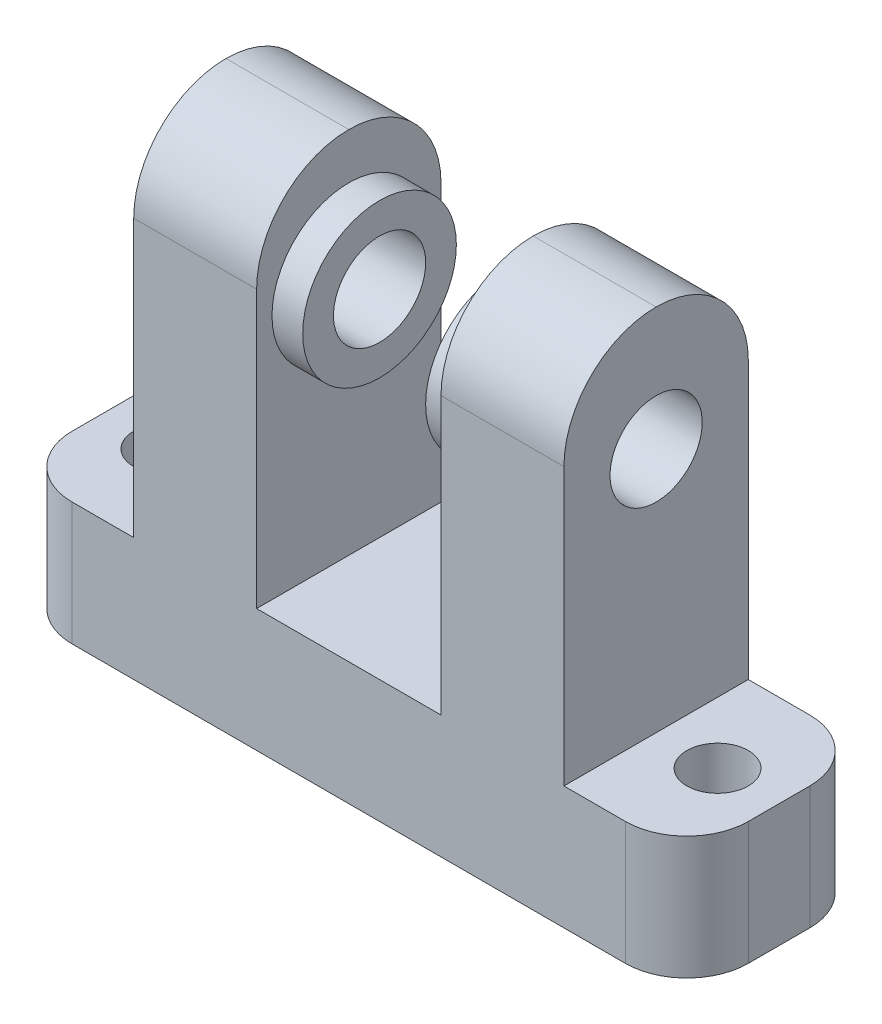
ISO-10303-21;
HEADER;
FILE_DESCRIPTION(('STEP AP214'),'2;1');
FILE_NAME('part.step','',(''),(''),'','','');
FILE_SCHEMA(('AUTOMOTIVE_DESIGN { 1 0 10303 214 1 1 1 1 }'));
ENDSEC;
DATA;
#1=APPLICATION_CONTEXT('core data for automotive mechanical design processes');
#2=APPLICATION_PROTOCOL_DEFINITION('international standard','automotive_design',2000,#1);
#3=PRODUCT_CONTEXT('',#1,'mechanical');
#4=PRODUCT('Part','Part','',(#3));
#5=PRODUCT_RELATED_PRODUCT_CATEGORY('part','',(#4));
#6=PRODUCT_DEFINITION_FORMATION('','',#4);
#7=PRODUCT_DEFINITION_CONTEXT('part definition',#1,'design');
#8=PRODUCT_DEFINITION('design','',#6,#7);
#9=PRODUCT_DEFINITION_SHAPE('','',#8);
#10=(LENGTH_UNIT() NAMED_UNIT(*) SI_UNIT(.MILLI.,.METRE.));
#11=(NAMED_UNIT(*) PLANE_ANGLE_UNIT() SI_UNIT($,.RADIAN.));
#12=(NAMED_UNIT(*) SI_UNIT($,.STERADIAN.) SOLID_ANGLE_UNIT());
#13=UNCERTAINTY_MEASURE_WITH_UNIT(LENGTH_MEASURE(1.E-05),#10,'distance_accuracy_value','');
#14=(GEOMETRIC_REPRESENTATION_CONTEXT(3) GLOBAL_UNCERTAINTY_ASSIGNED_CONTEXT((#13)) GLOBAL_UNIT_ASSIGNED_CONTEXT((#10,
#11,#12)) REPRESENTATION_CONTEXT('',''));
#15=CARTESIAN_POINT('',(0.,0.,0.));
#16=DIRECTION('',(0.,0.,1.));
#17=DIRECTION('',(1.,0.,0.));
#18=AXIS2_PLACEMENT_3D('',#15,#16,#17);
#19=CARTESIAN_POINT('',(-7.,4.,-3.));
#20=DIRECTION('',(1.,0.,0.));
#21=DIRECTION('',(0.,0.,-1.));
#22=AXIS2_PLACEMENT_3D('',#19,#20,#21);
#23=PLANE('',#22);
#24=CARTESIAN_POINT('',(-7.,12.,0.));
#25=DIRECTION('',(1.,0.,0.));
#26=DIRECTION('',(0.,0.,-1.));
#27=AXIS2_PLACEMENT_3D('',#24,#25,#26);
#28=CIRCLE('',#27,1.5);
#29=CARTESIAN_POINT('',(-7.,12.,-1.5));
#30=VERTEX_POINT('',#29);
#31=EDGE_CURVE('E234',#30,#30,#28,.T.);
#32=ORIENTED_EDGE('',*,*,#31,.T.);
#33=EDGE_LOOP('',(#32));
#34=FACE_BOUND('',#33,.T.);
#35=CARTESIAN_POINT('',(-7.,13.,0.));
#36=DIRECTION('',(1.,0.,0.));
#37=DIRECTION('',(0.,0.,-1.));
#38=AXIS2_PLACEMENT_3D('',#35,#36,#37);
#39=CIRCLE('',#38,3.);
#40=CARTESIAN_POINT('',(-7.,13.,3.));
#41=VERTEX_POINT('',#40);
#42=CARTESIAN_POINT('',(-7.,16.,0.));
#43=VERTEX_POINT('',#42);
#44=EDGE_CURVE('E309',#41,#43,#39,.F.);
#45=ORIENTED_EDGE('',*,*,#44,.T.);
#46=CARTESIAN_POINT('',(-7.,13.,0.));
#47=DIRECTION('',(1.,0.,0.));
#48=DIRECTION('',(0.,0.,-1.));
#49=AXIS2_PLACEMENT_3D('',#46,#47,#48);
#50=CIRCLE('',#49,3.);
#51=CARTESIAN_POINT('',(-7.,13.,-3.));
#52=VERTEX_POINT('',#51);
#53=EDGE_CURVE('E166',#43,#52,#50,.F.);
#54=ORIENTED_EDGE('',*,*,#53,.T.);
#55=DIRECTION('',(0.,-1.,0.));
#56=VECTOR('',#55,1.);
#57=CARTESIAN_POINT('',(-7.,4.,-3.));
#58=LINE('',#57,#56);
#59=CARTESIAN_POINT('',(-7.,4.,-3.));
#60=VERTEX_POINT('',#59);
#61=EDGE_CURVE('E160',#52,#60,#58,.T.);
#62=ORIENTED_EDGE('',*,*,#61,.T.);
#63=DIRECTION('',(0.,0.,-1.));
#64=VECTOR('',#63,1.);
#65=CARTESIAN_POINT('',(-7.,4.,3.));
#66=LINE('',#65,#64);
#67=CARTESIAN_POINT('',(-7.,4.,3.));
#68=VERTEX_POINT('',#67);
#69=EDGE_CURVE('E164',#68,#60,#66,.T.);
#70=ORIENTED_EDGE('',*,*,#69,.F.);
#71=DIRECTION('',(0.,-1.,0.));
#72=VECTOR('',#71,1.);
#73=CARTESIAN_POINT('',(-7.,4.,3.));
#74=LINE('',#73,#72);
#75=EDGE_CURVE('E171',#41,#68,#74,.T.);
#76=ORIENTED_EDGE('',*,*,#75,.F.);
#77=EDGE_LOOP('',(#45,#54,#62,#70,#76));
#78=FACE_BOUND('',#77,.T.);
#79=ADVANCED_FACE('F36',(#34,#78),#23,.F.);
#80=CARTESIAN_POINT('',(7.,4.,-3.));
#81=DIRECTION('',(-1.,0.,0.));
#82=DIRECTION('',(0.,0.,1.));
#83=AXIS2_PLACEMENT_3D('',#80,#81,#82);
#84=PLANE('',#83);
#85=CARTESIAN_POINT('',(7.,12.,0.));
#86=DIRECTION('',(-1.,0.,0.));
#87=DIRECTION('',(0.,0.,1.));
#88=AXIS2_PLACEMENT_3D('',#85,#86,#87);
#89=CIRCLE('',#88,1.5);
#90=CARTESIAN_POINT('',(7.,12.,1.5));
#91=VERTEX_POINT('',#90);
#92=EDGE_CURVE('E237',#91,#91,#89,.T.);
#93=ORIENTED_EDGE('',*,*,#92,.T.);
#94=EDGE_LOOP('',(#93));
#95=FACE_BOUND('',#94,.T.);
#96=DIRECTION('',(0.,-1.,0.));
#97=VECTOR('',#96,1.);
#98=CARTESIAN_POINT('',(7.,4.,-3.));
#99=LINE('',#98,#97);
#100=CARTESIAN_POINT('',(7.,13.,-3.));
#101=VERTEX_POINT('',#100);
#102=CARTESIAN_POINT('',(7.,4.,-3.));
#103=VERTEX_POINT('',#102);
#104=EDGE_CURVE('E170',#101,#103,#99,.T.);
#105=ORIENTED_EDGE('',*,*,#104,.F.);
#106=CARTESIAN_POINT('',(7.,13.,0.));
#107=DIRECTION('',(-1.,0.,0.));
#108=DIRECTION('',(0.,0.,1.));
#109=AXIS2_PLACEMENT_3D('',#106,#107,#108);
#110=CIRCLE('',#109,3.);
#111=CARTESIAN_POINT('',(7.,16.,0.));
#112=VERTEX_POINT('',#111);
#113=EDGE_CURVE('E58',#101,#112,#110,.F.);
#114=ORIENTED_EDGE('',*,*,#113,.T.);
#115=CARTESIAN_POINT('',(7.,13.,0.));
#116=DIRECTION('',(-1.,0.,0.));
#117=DIRECTION('',(0.,0.,1.));
#118=AXIS2_PLACEMENT_3D('',#115,#116,#117);
#119=CIRCLE('',#118,3.);
#120=CARTESIAN_POINT('',(7.,13.,3.));
#121=VERTEX_POINT('',#120);
#122=EDGE_CURVE('E53',#112,#121,#119,.F.);
#123=ORIENTED_EDGE('',*,*,#122,.T.);
#124=DIRECTION('',(0.,-1.,0.));
#125=VECTOR('',#124,1.);
#126=CARTESIAN_POINT('',(7.,4.,3.));
#127=LINE('',#126,#125);
#128=CARTESIAN_POINT('',(7.,4.,3.));
#129=VERTEX_POINT('',#128);
#130=EDGE_CURVE('E262',#121,#129,#127,.T.);
#131=ORIENTED_EDGE('',*,*,#130,.T.);
#132=DIRECTION('',(0.,0.,1.));
#133=VECTOR('',#132,1.);
#134=CARTESIAN_POINT('',(7.,4.,-3.));
#135=LINE('',#134,#133);
#136=EDGE_CURVE('E205',#103,#129,#135,.T.);
#137=ORIENTED_EDGE('',*,*,#136,.F.);
#138=EDGE_LOOP('',(#105,#114,#123,#131,#137));
#139=FACE_BOUND('',#138,.T.);
#140=ADVANCED_FACE('F400',(#95,#139),#84,.F.);
#141=CARTESIAN_POINT('',(3.,16.,3.));
#142=DIRECTION('',(1.,0.,0.));
#143=DIRECTION('',(0.,0.,-1.));
#144=AXIS2_PLACEMENT_3D('',#141,#142,#143);
#145=PLANE('',#144);
#146=CARTESIAN_POINT('',(3.,13.,0.));
#147=DIRECTION('',(1.,0.,0.));
#148=DIRECTION('',(0.,0.,-1.));
#149=AXIS2_PLACEMENT_3D('',#146,#147,#148);
#150=CIRCLE('',#149,3.);
#151=CARTESIAN_POINT('',(3.,13.,3.));
#152=VERTEX_POINT('',#151);
#153=CARTESIAN_POINT('',(3.,16.,0.));
#154=VERTEX_POINT('',#153);
#155=EDGE_CURVE('E321',#152,#154,#150,.F.);
#156=ORIENTED_EDGE('',*,*,#155,.T.);
#157=CARTESIAN_POINT('',(3.,13.,0.));
#158=DIRECTION('',(1.,0.,0.));
#159=DIRECTION('',(0.,0.,-1.));
#160=AXIS2_PLACEMENT_3D('',#157,#158,#159);
#161=CIRCLE('',#160,3.);
#162=CARTESIAN_POINT('',(3.,13.,-3.));
#163=VERTEX_POINT('',#162);
#164=EDGE_CURVE('E323',#154,#163,#161,.F.);
#165=ORIENTED_EDGE('',*,*,#164,.T.);
#166=DIRECTION('',(0.,-1.,0.));
#167=VECTOR('',#166,1.);
#168=CARTESIAN_POINT('',(3.,16.,-3.));
#169=LINE('',#168,#167);
#170=CARTESIAN_POINT('',(3.,4.,-3.));
#171=VERTEX_POINT('',#170);
#172=EDGE_CURVE('E240',#163,#171,#169,.T.);
#173=ORIENTED_EDGE('',*,*,#172,.T.);
#174=DIRECTION('',(0.,0.,1.));
#175=VECTOR('',#174,1.);
#176=CARTESIAN_POINT('',(3.,4.,3.));
#177=LINE('',#176,#175);
#178=CARTESIAN_POINT('',(3.,4.,3.));
#179=VERTEX_POINT('',#178);
#180=EDGE_CURVE('E244',#171,#179,#177,.T.);
#181=ORIENTED_EDGE('',*,*,#180,.T.);
#182=DIRECTION('',(0.,-1.,0.));
#183=VECTOR('',#182,1.);
#184=CARTESIAN_POINT('',(3.,16.,3.));
#185=LINE('',#184,#183);
#186=EDGE_CURVE('E242',#152,#179,#185,.T.);
#187=ORIENTED_EDGE('',*,*,#186,.F.);
#188=EDGE_LOOP('',(#156,#165,#173,#181,#187));
#189=FACE_BOUND('',#188,.T.);
#190=CARTESIAN_POINT('',(3.,12.,0.));
#191=DIRECTION('',(1.,0.,0.));
#192=DIRECTION('',(0.,0.,-1.));
#193=AXIS2_PLACEMENT_3D('',#190,#191,#192);
#194=CIRCLE('',#193,2.5);
#195=CARTESIAN_POINT('',(3.,12.,-2.5));
#196=VERTEX_POINT('',#195);
#197=EDGE_CURVE('E272',#196,#196,#194,.F.);
#198=ORIENTED_EDGE('',*,*,#197,.F.);
#199=EDGE_LOOP('',(#198));
#200=FACE_BOUND('',#199,.T.);
#201=ADVANCED_FACE('F345',(#189,#200),#145,.F.);
#202=CARTESIAN_POINT('',(-3.,16.,3.));
#203=DIRECTION('',(-1.,0.,0.));
#204=DIRECTION('',(0.,0.,1.));
#205=AXIS2_PLACEMENT_3D('',#202,#203,#204);
#206=PLANE('',#205);
#207=DIRECTION('',(0.,-1.,0.));
#208=VECTOR('',#207,1.);
#209=CARTESIAN_POINT('',(-3.,16.,-3.));
#210=LINE('',#209,#208);
#211=CARTESIAN_POINT('',(-3.,13.,-3.));
#212=VERTEX_POINT('',#211);
#213=CARTESIAN_POINT('',(-3.,4.,-3.));
#214=VERTEX_POINT('',#213);
#215=EDGE_CURVE('E250',#212,#214,#210,.T.);
#216=ORIENTED_EDGE('',*,*,#215,.F.);
#217=CARTESIAN_POINT('',(-3.,13.,0.));
#218=DIRECTION('',(-1.,0.,0.));
#219=DIRECTION('',(0.,0.,1.));
#220=AXIS2_PLACEMENT_3D('',#217,#218,#219);
#221=CIRCLE('',#220,3.);
#222=CARTESIAN_POINT('',(-3.,16.,0.));
#223=VERTEX_POINT('',#222);
#224=EDGE_CURVE('E319',#212,#223,#221,.F.);
#225=ORIENTED_EDGE('',*,*,#224,.T.);
#226=CARTESIAN_POINT('',(-3.,13.,0.));
#227=DIRECTION('',(-1.,0.,0.));
#228=DIRECTION('',(0.,0.,1.));
#229=AXIS2_PLACEMENT_3D('',#226,#227,#228);
#230=CIRCLE('',#229,3.);
#231=CARTESIAN_POINT('',(-3.,13.,3.));
#232=VERTEX_POINT('',#231);
#233=EDGE_CURVE('E317',#223,#232,#230,.F.);
#234=ORIENTED_EDGE('',*,*,#233,.T.);
#235=DIRECTION('',(0.,-1.,0.));
#236=VECTOR('',#235,1.);
#237=CARTESIAN_POINT('',(-3.,16.,3.));
#238=LINE('',#237,#236);
#239=CARTESIAN_POINT('',(-3.,4.,3.));
#240=VERTEX_POINT('',#239);
#241=EDGE_CURVE('E252',#232,#240,#238,.T.);
#242=ORIENTED_EDGE('',*,*,#241,.T.);
#243=DIRECTION('',(0.,0.,-1.));
#244=VECTOR('',#243,1.);
#245=CARTESIAN_POINT('',(-3.,4.,3.));
#246=LINE('',#245,#244);
#247=EDGE_CURVE('E247',#240,#214,#246,.T.);
#248=ORIENTED_EDGE('',*,*,#247,.T.);
#249=EDGE_LOOP('',(#216,#225,#234,#242,#248));
#250=FACE_BOUND('',#249,.T.);
#251=CARTESIAN_POINT('',(-3.,12.,0.));
#252=DIRECTION('',(-1.,0.,0.));
#253=DIRECTION('',(0.,0.,1.));
#254=AXIS2_PLACEMENT_3D('',#251,#252,#253);
#255=CIRCLE('',#254,2.5);
#256=CARTESIAN_POINT('',(-3.,12.,2.5));
#257=VERTEX_POINT('',#256);
#258=EDGE_CURVE('E269',#257,#257,#255,.F.);
#259=ORIENTED_EDGE('',*,*,#258,.F.);
#260=EDGE_LOOP('',(#259));
#261=FACE_BOUND('',#260,.T.);
#262=ADVANCED_FACE('F355',(#250,#261),#206,.F.);
#263=CARTESIAN_POINT('',(0.,4.,0.));
#264=DIRECTION('',(0.,1.,0.));
#265=DIRECTION('',(0.,0.,1.));
#266=AXIS2_PLACEMENT_3D('',#263,#264,#265);
#267=PLANE('',#266);
#268=DIRECTION('',(1.,0.,0.));
#269=VECTOR('',#268,1.);
#270=CARTESIAN_POINT('',(-7.,4.,3.));
#271=LINE('',#270,#269);
#272=EDGE_CURVE('E258',#240,#179,#271,.T.);
#273=ORIENTED_EDGE('',*,*,#272,.T.);
#274=ORIENTED_EDGE('',*,*,#180,.F.);
#275=DIRECTION('',(-1.,0.,0.));
#276=VECTOR('',#275,1.);
#277=CARTESIAN_POINT('',(-7.,4.,-3.));
#278=LINE('',#277,#276);
#279=EDGE_CURVE('E255',#171,#214,#278,.T.);
#280=ORIENTED_EDGE('',*,*,#279,.T.);
#281=ORIENTED_EDGE('',*,*,#247,.F.);
#282=EDGE_LOOP('',(#273,#274,#280,#281));
#283=FACE_BOUND('',#282,.T.);
#284=ADVANCED_FACE('F351',(#283),#267,.T.);
#285=CARTESIAN_POINT('',(-7.,4.,-3.));
#286=DIRECTION('',(0.,0.,1.));
#287=DIRECTION('',(1.,0.,0.));
#288=AXIS2_PLACEMENT_3D('',#285,#286,#287);
#289=PLANE('',#288);
#290=ORIENTED_EDGE('',*,*,#61,.F.);
#291=DIRECTION('',(-1.,0.,0.));
#292=VECTOR('',#291,1.);
#293=CARTESIAN_POINT('',(-3.,13.,-3.));
#294=LINE('',#293,#292);
#295=EDGE_CURVE('E315',#52,#212,#294,.F.);
#296=ORIENTED_EDGE('',*,*,#295,.T.);
#297=ORIENTED_EDGE('',*,*,#215,.T.);
#298=ORIENTED_EDGE('',*,*,#279,.F.);
#299=ORIENTED_EDGE('',*,*,#172,.F.);
#300=DIRECTION('',(-1.,0.,0.));
#301=VECTOR('',#300,1.);
#302=CARTESIAN_POINT('',(-7.,13.,-3.));
#303=LINE('',#302,#301);
#304=EDGE_CURVE('E312',#163,#101,#303,.F.);
#305=ORIENTED_EDGE('',*,*,#304,.T.);
#306=ORIENTED_EDGE('',*,*,#104,.T.);
#307=DIRECTION('',(-1.,0.,0.));
#308=VECTOR('',#307,1.);
#309=CARTESIAN_POINT('',(11.,4.,-3.));
#310=LINE('',#309,#308);
#311=CARTESIAN_POINT('',(9.,4.,-3.));
#312=VERTEX_POINT('',#311);
#313=EDGE_CURVE('E212',#312,#103,#310,.T.);
#314=ORIENTED_EDGE('',*,*,#313,.F.);
#315=DIRECTION('',(0.,1.,0.));
#316=VECTOR('',#315,1.);
#317=CARTESIAN_POINT('',(9.,0.,-3.));
#318=LINE('',#317,#316);
#319=CARTESIAN_POINT('',(8.99999999999999,0.,-3.));
#320=VERTEX_POINT('',#319);
#321=EDGE_CURVE('E285',#312,#320,#318,.F.);
#322=ORIENTED_EDGE('',*,*,#321,.T.);
#323=DIRECTION('',(-1.,0.,0.));
#324=VECTOR('',#323,1.);
#325=CARTESIAN_POINT('',(-7.,0.,-3.));
#326=LINE('',#325,#324);
#327=CARTESIAN_POINT('',(-9.,0.,-3.));
#328=VERTEX_POINT('',#327);
#329=EDGE_CURVE('E254',#320,#328,#326,.T.);
#330=ORIENTED_EDGE('',*,*,#329,.T.);
#331=DIRECTION('',(0.,1.,0.));
#332=VECTOR('',#331,1.);
#333=CARTESIAN_POINT('',(-9.,4.,-3.));
#334=LINE('',#333,#332);
#335=CARTESIAN_POINT('',(-9.,4.,-3.));
#336=VERTEX_POINT('',#335);
#337=EDGE_CURVE('E179',#328,#336,#334,.T.);
#338=ORIENTED_EDGE('',*,*,#337,.T.);
#339=DIRECTION('',(-1.,0.,0.));
#340=VECTOR('',#339,1.);
#341=CARTESIAN_POINT('',(-7.,4.,-3.));
#342=LINE('',#341,#340);
#343=EDGE_CURVE('E175',#60,#336,#342,.T.);
#344=ORIENTED_EDGE('',*,*,#343,.F.);
#345=EDGE_LOOP('',(#290,#296,#297,#298,#299,#305,#306,#314,#322,#330,#338,#344));
#346=FACE_BOUND('',#345,.T.);
#347=ADVANCED_FACE('F176',(#346),#289,.F.);
#348=CARTESIAN_POINT('',(-7.,4.,3.));
#349=DIRECTION('',(0.,0.,-1.));
#350=DIRECTION('',(-1.,0.,0.));
#351=AXIS2_PLACEMENT_3D('',#348,#349,#350);
#352=PLANE('',#351);
#353=ORIENTED_EDGE('',*,*,#130,.F.);
#354=DIRECTION('',(1.,0.,0.));
#355=VECTOR('',#354,1.);
#356=CARTESIAN_POINT('',(-7.,13.,3.));
#357=LINE('',#356,#355);
#358=EDGE_CURVE('E11',#121,#152,#357,.F.);
#359=ORIENTED_EDGE('',*,*,#358,.T.);
#360=ORIENTED_EDGE('',*,*,#186,.T.);
#361=ORIENTED_EDGE('',*,*,#272,.F.);
#362=ORIENTED_EDGE('',*,*,#241,.F.);
#363=DIRECTION('',(1.,0.,0.));
#364=VECTOR('',#363,1.);
#365=CARTESIAN_POINT('',(-7.,13.,3.));
#366=LINE('',#365,#364);
#367=EDGE_CURVE('E45',#232,#41,#366,.F.);
#368=ORIENTED_EDGE('',*,*,#367,.T.);
#369=ORIENTED_EDGE('',*,*,#75,.T.);
#370=DIRECTION('',(1.,0.,0.));
#371=VECTOR('',#370,1.);
#372=CARTESIAN_POINT('',(-11.,4.,3.));
#373=LINE('',#372,#371);
#374=CARTESIAN_POINT('',(-9.,4.,3.));
#375=VERTEX_POINT('',#374);
#376=EDGE_CURVE('E186',#375,#68,#373,.T.);
#377=ORIENTED_EDGE('',*,*,#376,.F.);
#378=DIRECTION('',(0.,1.,0.));
#379=VECTOR('',#378,1.);
#380=CARTESIAN_POINT('',(-9.,0.,3.));
#381=LINE('',#380,#379);
#382=CARTESIAN_POINT('',(-9.,0.,3.));
#383=VERTEX_POINT('',#382);
#384=EDGE_CURVE('E307',#375,#383,#381,.F.);
#385=ORIENTED_EDGE('',*,*,#384,.T.);
#386=DIRECTION('',(1.,0.,0.));
#387=VECTOR('',#386,1.);
#388=CARTESIAN_POINT('',(-7.,0.,3.));
#389=LINE('',#388,#387);
#390=CARTESIAN_POINT('',(8.99999999999999,0.,3.));
#391=VERTEX_POINT('',#390);
#392=EDGE_CURVE('E259',#383,#391,#389,.T.);
#393=ORIENTED_EDGE('',*,*,#392,.T.);
#394=DIRECTION('',(0.,1.,0.));
#395=VECTOR('',#394,1.);
#396=CARTESIAN_POINT('',(9.,4.,3.));
#397=LINE('',#396,#395);
#398=CARTESIAN_POINT('',(9.,4.,3.));
#399=VERTEX_POINT('',#398);
#400=EDGE_CURVE('E304',#391,#399,#397,.T.);
#401=ORIENTED_EDGE('',*,*,#400,.T.);
#402=DIRECTION('',(1.,0.,0.));
#403=VECTOR('',#402,1.);
#404=CARTESIAN_POINT('',(11.,4.,3.));
#405=LINE('',#404,#403);
#406=EDGE_CURVE('E215',#129,#399,#405,.T.);
#407=ORIENTED_EDGE('',*,*,#406,.F.);
#408=EDGE_LOOP('',(#353,#359,#360,#361,#362,#368,#369,#377,#385,#393,#401,#407));
#409=FACE_BOUND('',#408,.T.);
#410=ADVANCED_FACE('F341',(#409),#352,.F.);
#411=CARTESIAN_POINT('',(0.,0.,0.));
#412=DIRECTION('',(0.,1.,0.));
#413=DIRECTION('',(0.,0.,1.));
#414=AXIS2_PLACEMENT_3D('',#411,#412,#413);
#415=PLANE('',#414);
#416=ORIENTED_EDGE('',*,*,#329,.F.);
#417=CARTESIAN_POINT('',(9.,0.,-1.));
#418=DIRECTION('',(0.,1.,0.));
#419=DIRECTION('',(0.,0.,1.));
#420=AXIS2_PLACEMENT_3D('',#417,#418,#419);
#421=CIRCLE('',#420,2.);
#422=CARTESIAN_POINT('',(11.,0.,-1.));
#423=VERTEX_POINT('',#422);
#424=EDGE_CURVE('E293',#320,#423,#421,.F.);
#425=ORIENTED_EDGE('',*,*,#424,.T.);
#426=DIRECTION('',(0.,0.,-1.));
#427=VECTOR('',#426,1.);
#428=CARTESIAN_POINT('',(11.,0.,-3.));
#429=LINE('',#428,#427);
#430=CARTESIAN_POINT('',(11.,0.,1.));
#431=VERTEX_POINT('',#430);
#432=EDGE_CURVE('E208',#431,#423,#429,.T.);
#433=ORIENTED_EDGE('',*,*,#432,.F.);
#434=CARTESIAN_POINT('',(9.,0.,1.));
#435=DIRECTION('',(0.,1.,0.));
#436=DIRECTION('',(0.,0.,1.));
#437=AXIS2_PLACEMENT_3D('',#434,#435,#436);
#438=CIRCLE('',#437,2.);
#439=EDGE_CURVE('E287',#431,#391,#438,.F.);
#440=ORIENTED_EDGE('',*,*,#439,.T.);
#441=ORIENTED_EDGE('',*,*,#392,.F.);
#442=CARTESIAN_POINT('',(-9.,0.,1.));
#443=DIRECTION('',(0.,1.,0.));
#444=DIRECTION('',(0.,0.,1.));
#445=AXIS2_PLACEMENT_3D('',#442,#443,#444);
#446=CIRCLE('',#445,2.);
#447=CARTESIAN_POINT('',(-11.,0.,1.));
#448=VERTEX_POINT('',#447);
#449=EDGE_CURVE('E289',#383,#448,#446,.F.);
#450=ORIENTED_EDGE('',*,*,#449,.T.);
#451=DIRECTION('',(0.,0.,1.));
#452=VECTOR('',#451,1.);
#453=CARTESIAN_POINT('',(-11.,0.,-3.));
#454=LINE('',#453,#452);
#455=CARTESIAN_POINT('',(-11.,0.,-1.));
#456=VERTEX_POINT('',#455);
#457=EDGE_CURVE('E192',#456,#448,#454,.T.);
#458=ORIENTED_EDGE('',*,*,#457,.F.);
#459=CARTESIAN_POINT('',(-9.,0.,-1.));
#460=DIRECTION('',(0.,1.,0.));
#461=DIRECTION('',(0.,0.,1.));
#462=AXIS2_PLACEMENT_3D('',#459,#460,#461);
#463=CIRCLE('',#462,2.);
#464=EDGE_CURVE('E291',#456,#328,#463,.F.);
#465=ORIENTED_EDGE('',*,*,#464,.T.);
#466=EDGE_LOOP('',(#416,#425,#433,#440,#441,#450,#458,#465));
#467=FACE_BOUND('',#466,.T.);
#468=CARTESIAN_POINT('',(9.,0.,0.));
#469=DIRECTION('',(0.,1.,0.));
#470=DIRECTION('',(0.,0.,1.));
#471=AXIS2_PLACEMENT_3D('',#468,#469,#470);
#472=CIRCLE('',#471,1.);
#473=CARTESIAN_POINT('',(9.,0.,1.));
#474=VERTEX_POINT('',#473);
#475=EDGE_CURVE('E202',#474,#474,#472,.T.);
#476=ORIENTED_EDGE('',*,*,#475,.T.);
#477=EDGE_LOOP('',(#476));
#478=FACE_BOUND('',#477,.T.);
#479=CARTESIAN_POINT('',(-9.,0.,0.));
#480=DIRECTION('',(0.,1.,0.));
#481=DIRECTION('',(0.,0.,1.));
#482=AXIS2_PLACEMENT_3D('',#479,#480,#481);
#483=CIRCLE('',#482,1.);
#484=CARTESIAN_POINT('',(-9.,0.,1.));
#485=VERTEX_POINT('',#484);
#486=EDGE_CURVE('E188',#485,#485,#483,.T.);
#487=ORIENTED_EDGE('',*,*,#486,.T.);
#488=EDGE_LOOP('',(#487));
#489=FACE_BOUND('',#488,.T.);
#490=ADVANCED_FACE('F372',(#467,#478,#489),#415,.F.);
#491=CARTESIAN_POINT('',(-7.,12.,0.));
#492=DIRECTION('',(1.,0.,0.));
#493=DIRECTION('',(0.,0.,-1.));
#494=AXIS2_PLACEMENT_3D('',#491,#492,#493);
#495=CYLINDRICAL_SURFACE('',#494,1.5);
#496=ORIENTED_EDGE('',*,*,#92,.F.);
#497=EDGE_LOOP('',(#496));
#498=FACE_BOUND('',#497,.T.);
#499=CARTESIAN_POINT('',(2.,12.,0.));
#500=DIRECTION('',(-1.,0.,0.));
#501=DIRECTION('',(0.,0.,1.));
#502=AXIS2_PLACEMENT_3D('',#499,#500,#501);
#503=CIRCLE('',#502,1.5);
#504=CARTESIAN_POINT('',(2.,12.,1.5));
#505=VERTEX_POINT('',#504);
#506=EDGE_CURVE('E211',#505,#505,#503,.T.);
#507=ORIENTED_EDGE('',*,*,#506,.T.);
#508=EDGE_LOOP('',(#507));
#509=FACE_BOUND('',#508,.T.);
#510=ADVANCED_FACE('F540',(#498,#509),#495,.F.);
#511=ORIENTED_EDGE('',*,*,#31,.F.);
#512=EDGE_LOOP('',(#511));
#513=FACE_BOUND('',#512,.T.);
#514=CARTESIAN_POINT('',(-2.,12.,0.));
#515=DIRECTION('',(1.,0.,0.));
#516=DIRECTION('',(0.,0.,-1.));
#517=AXIS2_PLACEMENT_3D('',#514,#515,#516);
#518=CIRCLE('',#517,1.5);
#519=CARTESIAN_POINT('',(-2.,12.,-1.5));
#520=VERTEX_POINT('',#519);
#521=EDGE_CURVE('E228',#520,#520,#518,.T.);
#522=ORIENTED_EDGE('',*,*,#521,.T.);
#523=EDGE_LOOP('',(#522));
#524=FACE_BOUND('',#523,.T.);
#525=ADVANCED_FACE('F532',(#513,#524),#495,.F.);
#526=CARTESIAN_POINT('',(-2.,12.,0.));
#527=DIRECTION('',(1.,0.,0.));
#528=DIRECTION('',(0.,0.,-1.));
#529=AXIS2_PLACEMENT_3D('',#526,#527,#528);
#530=PLANE('',#529);
#531=CARTESIAN_POINT('',(-2.,12.,0.));
#532=DIRECTION('',(1.,0.,0.));
#533=DIRECTION('',(0.,0.,-1.));
#534=AXIS2_PLACEMENT_3D('',#531,#532,#533);
#535=CIRCLE('',#534,2.5);
#536=CARTESIAN_POINT('',(-2.,12.,-2.5));
#537=VERTEX_POINT('',#536);
#538=EDGE_CURVE('E231',#537,#537,#535,.T.);
#539=ORIENTED_EDGE('',*,*,#538,.T.);
#540=EDGE_LOOP('',(#539));
#541=FACE_BOUND('',#540,.T.);
#542=ORIENTED_EDGE('',*,*,#521,.F.);
#543=EDGE_LOOP('',(#542));
#544=FACE_BOUND('',#543,.T.);
#545=ADVANCED_FACE('F524',(#541,#544),#530,.T.);
#546=CARTESIAN_POINT('',(-2.,12.,0.));
#547=DIRECTION('',(-1.,0.,0.));
#548=DIRECTION('',(0.,0.,1.));
#549=AXIS2_PLACEMENT_3D('',#546,#547,#548);
#550=CYLINDRICAL_SURFACE('',#549,2.5);
#551=ORIENTED_EDGE('',*,*,#538,.F.);
#552=EDGE_LOOP('',(#551));
#553=FACE_BOUND('',#552,.T.);
#554=ORIENTED_EDGE('',*,*,#258,.T.);
#555=EDGE_LOOP('',(#554));
#556=FACE_BOUND('',#555,.T.);
#557=ADVANCED_FACE('F515',(#553,#556),#550,.T.);
#558=CARTESIAN_POINT('',(2.,12.,0.));
#559=DIRECTION('',(-1.,0.,0.));
#560=DIRECTION('',(0.,0.,1.));
#561=AXIS2_PLACEMENT_3D('',#558,#559,#560);
#562=PLANE('',#561);
#563=CARTESIAN_POINT('',(2.,12.,0.));
#564=DIRECTION('',(-1.,0.,0.));
#565=DIRECTION('',(0.,0.,1.));
#566=AXIS2_PLACEMENT_3D('',#563,#564,#565);
#567=CIRCLE('',#566,2.5);
#568=CARTESIAN_POINT('',(2.,12.,2.5));
#569=VERTEX_POINT('',#568);
#570=EDGE_CURVE('E225',#569,#569,#567,.T.);
#571=ORIENTED_EDGE('',*,*,#570,.T.);
#572=EDGE_LOOP('',(#571));
#573=FACE_BOUND('',#572,.T.);
#574=ORIENTED_EDGE('',*,*,#506,.F.);
#575=EDGE_LOOP('',(#574));
#576=FACE_BOUND('',#575,.T.);
#577=ADVANCED_FACE('F507',(#573,#576),#562,.T.);
#578=CARTESIAN_POINT('',(2.,12.,0.));
#579=DIRECTION('',(1.,0.,0.));
#580=DIRECTION('',(0.,0.,-1.));
#581=AXIS2_PLACEMENT_3D('',#578,#579,#580);
#582=CYLINDRICAL_SURFACE('',#581,2.5);
#583=ORIENTED_EDGE('',*,*,#570,.F.);
#584=EDGE_LOOP('',(#583));
#585=FACE_BOUND('',#584,.T.);
#586=ORIENTED_EDGE('',*,*,#197,.T.);
#587=EDGE_LOOP('',(#586));
#588=FACE_BOUND('',#587,.T.);
#589=ADVANCED_FACE('F501',(#585,#588),#582,.T.);
#590=CARTESIAN_POINT('',(11.,0.,-3.));
#591=DIRECTION('',(1.,0.,0.));
#592=DIRECTION('',(0.,0.,-1.));
#593=AXIS2_PLACEMENT_3D('',#590,#591,#592);
#594=PLANE('',#593);
#595=ORIENTED_EDGE('',*,*,#432,.T.);
#596=DIRECTION('',(0.,1.,0.));
#597=VECTOR('',#596,1.);
#598=CARTESIAN_POINT('',(11.,4.,-1.));
#599=LINE('',#598,#597);
#600=CARTESIAN_POINT('',(11.,4.,-1.));
#601=VERTEX_POINT('',#600);
#602=EDGE_CURVE('E277',#423,#601,#599,.T.);
#603=ORIENTED_EDGE('',*,*,#602,.T.);
#604=DIRECTION('',(0.,0.,-1.));
#605=VECTOR('',#604,1.);
#606=CARTESIAN_POINT('',(11.,4.,-3.));
#607=LINE('',#606,#605);
#608=CARTESIAN_POINT('',(11.,4.,1.));
#609=VERTEX_POINT('',#608);
#610=EDGE_CURVE('E218',#609,#601,#607,.T.);
#611=ORIENTED_EDGE('',*,*,#610,.F.);
#612=DIRECTION('',(0.,1.,0.));
#613=VECTOR('',#612,1.);
#614=CARTESIAN_POINT('',(11.,0.,1.));
#615=LINE('',#614,#613);
#616=EDGE_CURVE('E275',#609,#431,#615,.F.);
#617=ORIENTED_EDGE('',*,*,#616,.T.);
#618=EDGE_LOOP('',(#595,#603,#611,#617));
#619=FACE_BOUND('',#618,.T.);
#620=ADVANCED_FACE('F391',(#619),#594,.T.);
#621=CARTESIAN_POINT('',(0.,4.,0.));
#622=DIRECTION('',(0.,-1.,0.));
#623=DIRECTION('',(0.,0.,-1.));
#624=AXIS2_PLACEMENT_3D('',#621,#622,#623);
#625=PLANE('',#624);
#626=CARTESIAN_POINT('',(9.,4.,0.));
#627=DIRECTION('',(0.,1.,0.));
#628=DIRECTION('',(0.,0.,1.));
#629=AXIS2_PLACEMENT_3D('',#626,#627,#628);
#630=CIRCLE('',#629,1.);
#631=CARTESIAN_POINT('',(9.,4.,1.));
#632=VERTEX_POINT('',#631);
#633=EDGE_CURVE('E199',#632,#632,#630,.T.);
#634=ORIENTED_EDGE('',*,*,#633,.F.);
#635=EDGE_LOOP('',(#634));
#636=FACE_BOUND('',#635,.T.);
#637=ORIENTED_EDGE('',*,*,#610,.T.);
#638=CARTESIAN_POINT('',(9.,4.,-1.));
#639=DIRECTION('',(0.,-1.,0.));
#640=DIRECTION('',(0.,0.,-1.));
#641=AXIS2_PLACEMENT_3D('',#638,#639,#640);
#642=CIRCLE('',#641,2.);
#643=EDGE_CURVE('E282',#601,#312,#642,.F.);
#644=ORIENTED_EDGE('',*,*,#643,.T.);
#645=ORIENTED_EDGE('',*,*,#313,.T.);
#646=ORIENTED_EDGE('',*,*,#136,.T.);
#647=ORIENTED_EDGE('',*,*,#406,.T.);
#648=CARTESIAN_POINT('',(9.,4.,1.));
#649=DIRECTION('',(0.,-1.,0.));
#650=DIRECTION('',(0.,0.,-1.));
#651=AXIS2_PLACEMENT_3D('',#648,#649,#650);
#652=CIRCLE('',#651,2.);
#653=EDGE_CURVE('E280',#399,#609,#652,.F.);
#654=ORIENTED_EDGE('',*,*,#653,.T.);
#655=EDGE_LOOP('',(#637,#644,#645,#646,#647,#654));
#656=FACE_BOUND('',#655,.T.);
#657=ADVANCED_FACE('F398',(#636,#656),#625,.F.);
#658=CARTESIAN_POINT('',(9.,0.,0.));
#659=DIRECTION('',(0.,1.,0.));
#660=DIRECTION('',(0.,0.,1.));
#661=AXIS2_PLACEMENT_3D('',#658,#659,#660);
#662=CYLINDRICAL_SURFACE('',#661,1.);
#663=ORIENTED_EDGE('',*,*,#475,.F.);
#664=EDGE_LOOP('',(#663));
#665=FACE_BOUND('',#664,.T.);
#666=ORIENTED_EDGE('',*,*,#633,.T.);
#667=EDGE_LOOP('',(#666));
#668=FACE_BOUND('',#667,.T.);
#669=ADVANCED_FACE('F480',(#665,#668),#662,.F.);
#670=CARTESIAN_POINT('',(-11.,0.,-3.));
#671=DIRECTION('',(-1.,0.,0.));
#672=DIRECTION('',(0.,0.,1.));
#673=AXIS2_PLACEMENT_3D('',#670,#671,#672);
#674=PLANE('',#673);
#675=DIRECTION('',(0.,0.,1.));
#676=VECTOR('',#675,1.);
#677=CARTESIAN_POINT('',(-11.,4.,-3.));
#678=LINE('',#677,#676);
#679=CARTESIAN_POINT('',(-11.,4.,-1.));
#680=VERTEX_POINT('',#679);
#681=CARTESIAN_POINT('',(-11.,4.,1.));
#682=VERTEX_POINT('',#681);
#683=EDGE_CURVE('E181',#680,#682,#678,.T.);
#684=ORIENTED_EDGE('',*,*,#683,.F.);
#685=DIRECTION('',(0.,1.,0.));
#686=VECTOR('',#685,1.);
#687=CARTESIAN_POINT('',(-11.,0.,-1.));
#688=LINE('',#687,#686);
#689=EDGE_CURVE('E302',#680,#456,#688,.F.);
#690=ORIENTED_EDGE('',*,*,#689,.T.);
#691=ORIENTED_EDGE('',*,*,#457,.T.);
#692=DIRECTION('',(0.,1.,0.));
#693=VECTOR('',#692,1.);
#694=CARTESIAN_POINT('',(-11.,4.,1.));
#695=LINE('',#694,#693);
#696=EDGE_CURVE('E299',#448,#682,#695,.T.);
#697=ORIENTED_EDGE('',*,*,#696,.T.);
#698=EDGE_LOOP('',(#684,#690,#691,#697));
#699=FACE_BOUND('',#698,.T.);
#700=ADVANCED_FACE('F377',(#699),#674,.T.);
#701=CARTESIAN_POINT('',(0.,4.,0.));
#702=DIRECTION('',(0.,1.,0.));
#703=DIRECTION('',(0.,0.,1.));
#704=AXIS2_PLACEMENT_3D('',#701,#702,#703);
#705=PLANE('',#704);
#706=CARTESIAN_POINT('',(-9.,4.,0.));
#707=DIRECTION('',(0.,1.,0.));
#708=DIRECTION('',(0.,0.,1.));
#709=AXIS2_PLACEMENT_3D('',#706,#707,#708);
#710=CIRCLE('',#709,1.);
#711=CARTESIAN_POINT('',(-9.,4.,1.));
#712=VERTEX_POINT('',#711);
#713=EDGE_CURVE('E196',#712,#712,#710,.T.);
#714=ORIENTED_EDGE('',*,*,#713,.F.);
#715=EDGE_LOOP('',(#714));
#716=FACE_BOUND('',#715,.T.);
#717=ORIENTED_EDGE('',*,*,#343,.T.);
#718=CARTESIAN_POINT('',(-9.,4.,-1.));
#719=DIRECTION('',(0.,1.,0.));
#720=DIRECTION('',(0.,0.,1.));
#721=AXIS2_PLACEMENT_3D('',#718,#719,#720);
#722=CIRCLE('',#721,2.);
#723=EDGE_CURVE('E297',#336,#680,#722,.T.);
#724=ORIENTED_EDGE('',*,*,#723,.T.);
#725=ORIENTED_EDGE('',*,*,#683,.T.);
#726=CARTESIAN_POINT('',(-9.,4.,1.));
#727=DIRECTION('',(0.,1.,0.));
#728=DIRECTION('',(0.,0.,1.));
#729=AXIS2_PLACEMENT_3D('',#726,#727,#728);
#730=CIRCLE('',#729,2.);
#731=EDGE_CURVE('E295',#682,#375,#730,.T.);
#732=ORIENTED_EDGE('',*,*,#731,.T.);
#733=ORIENTED_EDGE('',*,*,#376,.T.);
#734=ORIENTED_EDGE('',*,*,#69,.T.);
#735=EDGE_LOOP('',(#717,#724,#725,#732,#733,#734));
#736=FACE_BOUND('',#735,.T.);
#737=ADVANCED_FACE('F184',(#716,#736),#705,.T.);
#738=CARTESIAN_POINT('',(-9.,0.,0.));
#739=DIRECTION('',(0.,1.,0.));
#740=DIRECTION('',(0.,0.,1.));
#741=AXIS2_PLACEMENT_3D('',#738,#739,#740);
#742=CYLINDRICAL_SURFACE('',#741,1.);
#743=ORIENTED_EDGE('',*,*,#486,.F.);
#744=EDGE_LOOP('',(#743));
#745=FACE_BOUND('',#744,.T.);
#746=ORIENTED_EDGE('',*,*,#713,.T.);
#747=EDGE_LOOP('',(#746));
#748=FACE_BOUND('',#747,.T.);
#749=ADVANCED_FACE('F415',(#745,#748),#742,.F.);
#750=CARTESIAN_POINT('',(9.,0.,-1.));
#751=DIRECTION('',(0.,-1.,0.));
#752=DIRECTION('',(0.,0.,-1.));
#753=AXIS2_PLACEMENT_3D('',#750,#751,#752);
#754=CYLINDRICAL_SURFACE('',#753,2.);
#755=ORIENTED_EDGE('',*,*,#424,.F.);
#756=ORIENTED_EDGE('',*,*,#321,.F.);
#757=ORIENTED_EDGE('',*,*,#643,.F.);
#758=ORIENTED_EDGE('',*,*,#602,.F.);
#759=EDGE_LOOP('',(#755,#756,#757,#758));
#760=FACE_BOUND('',#759,.T.);
#761=ADVANCED_FACE('F386',(#760),#754,.T.);
#762=CARTESIAN_POINT('',(-9.,4.,-1.));
#763=DIRECTION('',(0.,-1.,0.));
#764=DIRECTION('',(0.,0.,-1.));
#765=AXIS2_PLACEMENT_3D('',#762,#763,#764);
#766=CYLINDRICAL_SURFACE('',#765,2.);
#767=ORIENTED_EDGE('',*,*,#464,.F.);
#768=ORIENTED_EDGE('',*,*,#689,.F.);
#769=ORIENTED_EDGE('',*,*,#723,.F.);
#770=ORIENTED_EDGE('',*,*,#337,.F.);
#771=EDGE_LOOP('',(#767,#768,#769,#770));
#772=FACE_BOUND('',#771,.T.);
#773=ADVANCED_FACE('F381',(#772),#766,.T.);
#774=CARTESIAN_POINT('',(-9.,0.,1.));
#775=DIRECTION('',(0.,-1.,0.));
#776=DIRECTION('',(0.,0.,-1.));
#777=AXIS2_PLACEMENT_3D('',#774,#775,#776);
#778=CYLINDRICAL_SURFACE('',#777,2.);
#779=ORIENTED_EDGE('',*,*,#449,.F.);
#780=ORIENTED_EDGE('',*,*,#384,.F.);
#781=ORIENTED_EDGE('',*,*,#731,.F.);
#782=ORIENTED_EDGE('',*,*,#696,.F.);
#783=EDGE_LOOP('',(#779,#780,#781,#782));
#784=FACE_BOUND('',#783,.T.);
#785=ADVANCED_FACE('F367',(#784),#778,.T.);
#786=CARTESIAN_POINT('',(9.,4.,1.));
#787=DIRECTION('',(0.,-1.,0.));
#788=DIRECTION('',(0.,0.,-1.));
#789=AXIS2_PLACEMENT_3D('',#786,#787,#788);
#790=CYLINDRICAL_SURFACE('',#789,2.);
#791=ORIENTED_EDGE('',*,*,#439,.F.);
#792=ORIENTED_EDGE('',*,*,#616,.F.);
#793=ORIENTED_EDGE('',*,*,#653,.F.);
#794=ORIENTED_EDGE('',*,*,#400,.F.);
#795=EDGE_LOOP('',(#791,#792,#793,#794));
#796=FACE_BOUND('',#795,.T.);
#797=ADVANCED_FACE('F395',(#796),#790,.T.);
#798=CARTESIAN_POINT('',(0.,13.,0.));
#799=DIRECTION('',(-1.,0.,0.));
#800=DIRECTION('',(0.,0.,1.));
#801=AXIS2_PLACEMENT_3D('',#798,#799,#800);
#802=CYLINDRICAL_SURFACE('',#801,3.);
#803=ORIENTED_EDGE('',*,*,#367,.F.);
#804=ORIENTED_EDGE('',*,*,#233,.F.);
#805=DIRECTION('',(1.,0.,0.));
#806=VECTOR('',#805,1.);
#807=CARTESIAN_POINT('',(-3.,16.,0.));
#808=LINE('',#807,#806);
#809=EDGE_CURVE('E195',#43,#223,#808,.T.);
#810=ORIENTED_EDGE('',*,*,#809,.F.);
#811=ORIENTED_EDGE('',*,*,#44,.F.);
#812=EDGE_LOOP('',(#803,#804,#810,#811));
#813=FACE_BOUND('',#812,.T.);
#814=ADVANCED_FACE('F362',(#813),#802,.T.);
#815=CARTESIAN_POINT('',(0.,13.,0.));
#816=DIRECTION('',(1.,0.,0.));
#817=DIRECTION('',(0.,0.,-1.));
#818=AXIS2_PLACEMENT_3D('',#815,#816,#817);
#819=CYLINDRICAL_SURFACE('',#818,3.);
#820=ORIENTED_EDGE('',*,*,#224,.F.);
#821=ORIENTED_EDGE('',*,*,#295,.F.);
#822=ORIENTED_EDGE('',*,*,#53,.F.);
#823=ORIENTED_EDGE('',*,*,#809,.T.);
#824=EDGE_LOOP('',(#820,#821,#822,#823));
#825=FACE_BOUND('',#824,.T.);
#826=ADVANCED_FACE('F422',(#825),#819,.T.);
#827=CARTESIAN_POINT('',(0.,13.,0.));
#828=DIRECTION('',(1.,0.,0.));
#829=DIRECTION('',(0.,0.,-1.));
#830=AXIS2_PLACEMENT_3D('',#827,#828,#829);
#831=CYLINDRICAL_SURFACE('',#830,3.);
#832=ORIENTED_EDGE('',*,*,#358,.F.);
#833=ORIENTED_EDGE('',*,*,#122,.F.);
#834=DIRECTION('',(1.,0.,0.));
#835=VECTOR('',#834,1.);
#836=CARTESIAN_POINT('',(0.,16.,0.));
#837=LINE('',#836,#835);
#838=EDGE_CURVE('E40',#154,#112,#837,.T.);
#839=ORIENTED_EDGE('',*,*,#838,.F.);
#840=ORIENTED_EDGE('',*,*,#155,.F.);
#841=EDGE_LOOP('',(#832,#833,#839,#840));
#842=FACE_BOUND('',#841,.T.);
#843=ADVANCED_FACE('F38',(#842),#831,.T.);
#844=CARTESIAN_POINT('',(0.,13.,0.));
#845=DIRECTION('',(-1.,0.,0.));
#846=DIRECTION('',(0.,0.,1.));
#847=AXIS2_PLACEMENT_3D('',#844,#845,#846);
#848=CYLINDRICAL_SURFACE('',#847,3.);
#849=ORIENTED_EDGE('',*,*,#113,.F.);
#850=ORIENTED_EDGE('',*,*,#304,.F.);
#851=ORIENTED_EDGE('',*,*,#164,.F.);
#852=ORIENTED_EDGE('',*,*,#838,.T.);
#853=EDGE_LOOP('',(#849,#850,#851,#852));
#854=FACE_BOUND('',#853,.T.);
#855=ADVANCED_FACE('F334',(#854),#848,.T.);
#856=CLOSED_SHELL('',(#79,#140,#201,#262,#284,#347,#410,#490,#510,#525,#545,#557,#577,#589,#620,
#657,#669,#700,#737,#749,#761,#773,#785,#797,#814,#826,#843,#855));
#857=MANIFOLD_SOLID_BREP('B2',#856);
#858=ADVANCED_BREP_SHAPE_REPRESENTATION('',(#18,#857),#14);
#859=SHAPE_DEFINITION_REPRESENTATION(#9,#858);
ENDSEC;
END-ISO-10303-21;
